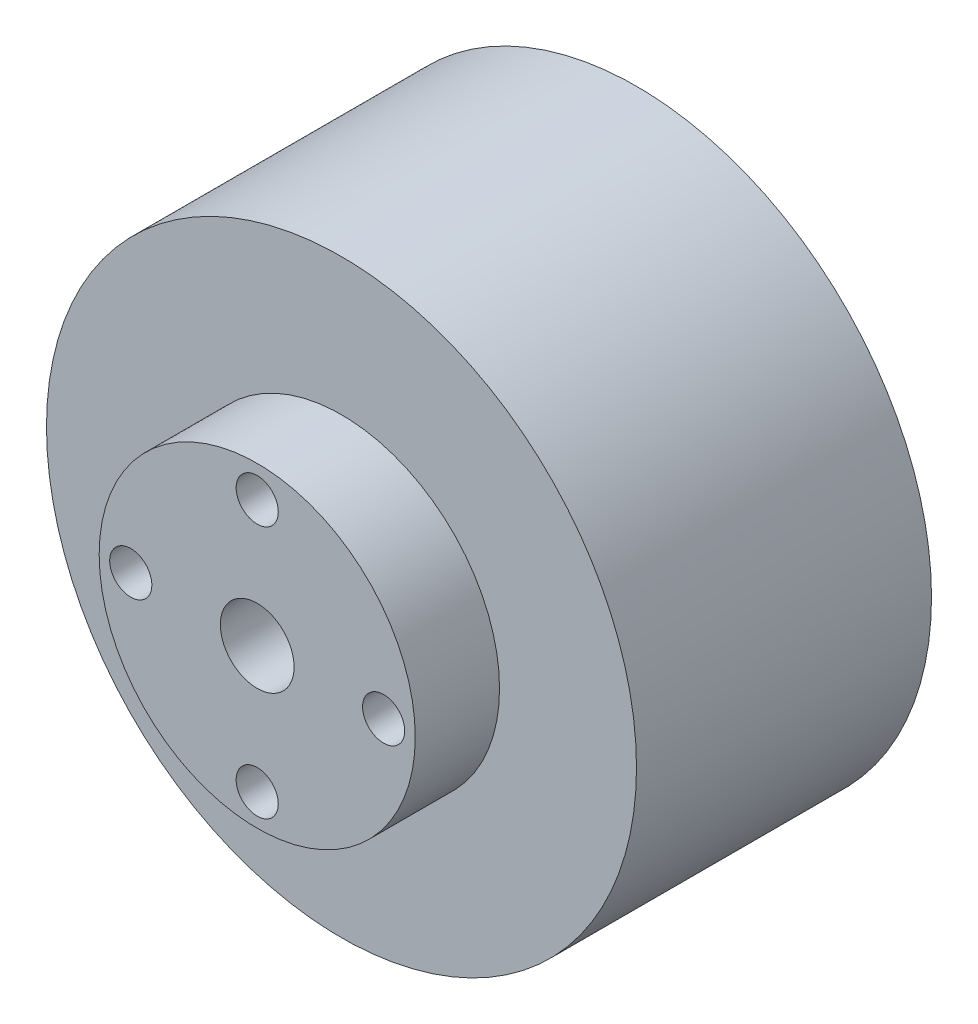
ISO-10303-21;
HEADER;
FILE_DESCRIPTION(('STEP AP214'),'2;1');
FILE_NAME('part.step','',(''),(''),'','','');
FILE_SCHEMA(('AUTOMOTIVE_DESIGN { 1 0 10303 214 1 1 1 1 }'));
ENDSEC;
DATA;
#1=APPLICATION_CONTEXT('core data for automotive mechanical design processes');
#2=APPLICATION_PROTOCOL_DEFINITION('international standard','automotive_design',2000,#1);
#3=PRODUCT_CONTEXT('',#1,'mechanical');
#4=PRODUCT('Part','Part','',(#3));
#5=PRODUCT_RELATED_PRODUCT_CATEGORY('part','',(#4));
#6=PRODUCT_DEFINITION_FORMATION('','',#4);
#7=PRODUCT_DEFINITION_CONTEXT('part definition',#1,'design');
#8=PRODUCT_DEFINITION('design','',#6,#7);
#9=PRODUCT_DEFINITION_SHAPE('','',#8);
#10=(LENGTH_UNIT() NAMED_UNIT(*) SI_UNIT(.MILLI.,.METRE.));
#11=(NAMED_UNIT(*) PLANE_ANGLE_UNIT() SI_UNIT($,.RADIAN.));
#12=(NAMED_UNIT(*) SI_UNIT($,.STERADIAN.) SOLID_ANGLE_UNIT());
#13=UNCERTAINTY_MEASURE_WITH_UNIT(LENGTH_MEASURE(1.E-05),#10,'distance_accuracy_value','');
#14=(GEOMETRIC_REPRESENTATION_CONTEXT(3) GLOBAL_UNCERTAINTY_ASSIGNED_CONTEXT((#13)) GLOBAL_UNIT_ASSIGNED_CONTEXT((#10,
#11,#12)) REPRESENTATION_CONTEXT('',''));
#15=CARTESIAN_POINT('',(0.,0.,0.));
#16=DIRECTION('',(0.,0.,1.));
#17=DIRECTION('',(1.,0.,0.));
#18=AXIS2_PLACEMENT_3D('',#15,#16,#17);
#19=CARTESIAN_POINT('',(0.,0.,14.));
#20=DIRECTION('',(0.,0.,-1.));
#21=DIRECTION('',(-1.,0.,0.));
#22=AXIS2_PLACEMENT_3D('',#19,#20,#21);
#23=CYLINDRICAL_SURFACE('',#22,14.);
#24=CARTESIAN_POINT('',(0.,0.,14.));
#25=DIRECTION('',(0.,0.,1.));
#26=DIRECTION('',(1.,0.,0.));
#27=AXIS2_PLACEMENT_3D('',#24,#25,#26);
#28=CIRCLE('',#27,14.);
#29=CARTESIAN_POINT('',(14.,0.,14.));
#30=VERTEX_POINT('',#29);
#31=EDGE_CURVE('E43',#30,#30,#28,.T.);
#32=ORIENTED_EDGE('',*,*,#31,.F.);
#33=EDGE_LOOP('',(#32));
#34=FACE_BOUND('',#33,.T.);
#35=CARTESIAN_POINT('',(0.,0.,0.));
#36=DIRECTION('',(0.,0.,1.));
#37=DIRECTION('',(1.,0.,0.));
#38=AXIS2_PLACEMENT_3D('',#35,#36,#37);
#39=CIRCLE('',#38,14.);
#40=CARTESIAN_POINT('',(14.,0.,0.));
#41=VERTEX_POINT('',#40);
#42=EDGE_CURVE('E39',#41,#41,#39,.T.);
#43=ORIENTED_EDGE('',*,*,#42,.T.);
#44=EDGE_LOOP('',(#43));
#45=FACE_BOUND('',#44,.T.);
#46=ADVANCED_FACE('F36',(#34,#45),#23,.T.);
#47=CARTESIAN_POINT('',(0.,0.,14.));
#48=DIRECTION('',(0.,0.,1.));
#49=DIRECTION('',(1.,0.,0.));
#50=AXIS2_PLACEMENT_3D('',#47,#48,#49);
#51=PLANE('',#50);
#52=CARTESIAN_POINT('',(0.,0.,14.));
#53=DIRECTION('',(0.,0.,1.));
#54=DIRECTION('',(1.,0.,0.));
#55=AXIS2_PLACEMENT_3D('',#52,#53,#54);
#56=CIRCLE('',#55,7.5);
#57=CARTESIAN_POINT('',(7.5,0.,14.));
#58=VERTEX_POINT('',#57);
#59=EDGE_CURVE('E10',#58,#58,#56,.T.);
#60=ORIENTED_EDGE('',*,*,#59,.F.);
#61=EDGE_LOOP('',(#60));
#62=FACE_BOUND('',#61,.T.);
#63=ORIENTED_EDGE('',*,*,#31,.T.);
#64=EDGE_LOOP('',(#63));
#65=FACE_BOUND('',#64,.T.);
#66=ADVANCED_FACE('F119',(#62,#65),#51,.T.);
#67=CARTESIAN_POINT('',(0.,0.,0.));
#68=DIRECTION('',(0.,0.,1.));
#69=DIRECTION('',(1.,0.,0.));
#70=AXIS2_PLACEMENT_3D('',#67,#68,#69);
#71=PLANE('',#70);
#72=CARTESIAN_POINT('',(0.,8.,0.));
#73=DIRECTION('',(0.,0.,1.));
#74=DIRECTION('',(1.,0.,0.));
#75=AXIS2_PLACEMENT_3D('',#72,#73,#74);
#76=CIRCLE('',#75,1.5);
#77=CARTESIAN_POINT('',(1.5,8.,0.));
#78=VERTEX_POINT('',#77);
#79=EDGE_CURVE('E101',#78,#78,#76,.T.);
#80=ORIENTED_EDGE('',*,*,#79,.T.);
#81=EDGE_LOOP('',(#80));
#82=FACE_BOUND('',#81,.T.);
#83=CARTESIAN_POINT('',(-8.,0.,0.));
#84=DIRECTION('',(0.,0.,1.));
#85=DIRECTION('',(1.,0.,0.));
#86=AXIS2_PLACEMENT_3D('',#83,#84,#85);
#87=CIRCLE('',#86,1.5);
#88=CARTESIAN_POINT('',(-6.5,0.,0.));
#89=VERTEX_POINT('',#88);
#90=EDGE_CURVE('E95',#89,#89,#87,.T.);
#91=ORIENTED_EDGE('',*,*,#90,.T.);
#92=EDGE_LOOP('',(#91));
#93=FACE_BOUND('',#92,.T.);
#94=CARTESIAN_POINT('',(0.,-8.,0.));
#95=DIRECTION('',(0.,0.,1.));
#96=DIRECTION('',(1.,0.,0.));
#97=AXIS2_PLACEMENT_3D('',#94,#95,#96);
#98=CIRCLE('',#97,1.5);
#99=CARTESIAN_POINT('',(1.5,-8.,0.));
#100=VERTEX_POINT('',#99);
#101=EDGE_CURVE('E89',#100,#100,#98,.T.);
#102=ORIENTED_EDGE('',*,*,#101,.T.);
#103=EDGE_LOOP('',(#102));
#104=FACE_BOUND('',#103,.T.);
#105=CARTESIAN_POINT('',(8.,0.,0.));
#106=DIRECTION('',(0.,0.,1.));
#107=DIRECTION('',(1.,0.,0.));
#108=AXIS2_PLACEMENT_3D('',#105,#106,#107);
#109=CIRCLE('',#108,1.5);
#110=CARTESIAN_POINT('',(9.5,0.,0.));
#111=VERTEX_POINT('',#110);
#112=EDGE_CURVE('E83',#111,#111,#109,.T.);
#113=ORIENTED_EDGE('',*,*,#112,.T.);
#114=EDGE_LOOP('',(#113));
#115=FACE_BOUND('',#114,.T.);
#116=CARTESIAN_POINT('',(0.,0.,0.));
#117=DIRECTION('',(0.,0.,1.));
#118=DIRECTION('',(1.,0.,0.));
#119=AXIS2_PLACEMENT_3D('',#116,#117,#118);
#120=CIRCLE('',#119,1.75);
#121=CARTESIAN_POINT('',(1.75,0.,0.));
#122=VERTEX_POINT('',#121);
#123=EDGE_CURVE('E52',#122,#122,#120,.T.);
#124=ORIENTED_EDGE('',*,*,#123,.T.);
#125=EDGE_LOOP('',(#124));
#126=FACE_BOUND('',#125,.T.);
#127=ORIENTED_EDGE('',*,*,#42,.F.);
#128=EDGE_LOOP('',(#127));
#129=FACE_BOUND('',#128,.T.);
#130=ADVANCED_FACE('F124',(#82,#93,#104,#115,#126,#129),#71,.F.);
#131=CARTESIAN_POINT('',(0.,0.,18.));
#132=DIRECTION('',(0.,0.,-1.));
#133=DIRECTION('',(-1.,0.,0.));
#134=AXIS2_PLACEMENT_3D('',#131,#132,#133);
#135=CYLINDRICAL_SURFACE('',#134,7.5);
#136=CARTESIAN_POINT('',(0.,0.,18.));
#137=DIRECTION('',(0.,0.,1.));
#138=DIRECTION('',(1.,0.,0.));
#139=AXIS2_PLACEMENT_3D('',#136,#137,#138);
#140=CIRCLE('',#139,7.5);
#141=CARTESIAN_POINT('',(7.5,0.,18.));
#142=VERTEX_POINT('',#141);
#143=EDGE_CURVE('E49',#142,#142,#140,.T.);
#144=ORIENTED_EDGE('',*,*,#143,.F.);
#145=EDGE_LOOP('',(#144));
#146=FACE_BOUND('',#145,.T.);
#147=ORIENTED_EDGE('',*,*,#59,.T.);
#148=EDGE_LOOP('',(#147));
#149=FACE_BOUND('',#148,.T.);
#150=ADVANCED_FACE('F133',(#146,#149),#135,.T.);
#151=CARTESIAN_POINT('',(0.,0.,18.));
#152=DIRECTION('',(0.,0.,1.));
#153=DIRECTION('',(1.,0.,0.));
#154=AXIS2_PLACEMENT_3D('',#151,#152,#153);
#155=PLANE('',#154);
#156=CARTESIAN_POINT('',(6.00000000000001,0.,18.));
#157=DIRECTION('',(0.,0.,1.));
#158=DIRECTION('',(1.,0.,0.));
#159=AXIS2_PLACEMENT_3D('',#156,#157,#158);
#160=CIRCLE('',#159,1.);
#161=CARTESIAN_POINT('',(7.00000000000001,0.,18.));
#162=VERTEX_POINT('',#161);
#163=EDGE_CURVE('E78',#162,#162,#160,.T.);
#164=ORIENTED_EDGE('',*,*,#163,.F.);
#165=EDGE_LOOP('',(#164));
#166=FACE_BOUND('',#165,.T.);
#167=CARTESIAN_POINT('',(-6.00000000000001,0.,18.));
#168=DIRECTION('',(0.,0.,1.));
#169=DIRECTION('',(1.,0.,0.));
#170=AXIS2_PLACEMENT_3D('',#167,#168,#169);
#171=CIRCLE('',#170,1.);
#172=CARTESIAN_POINT('',(-5.00000000000001,0.,18.));
#173=VERTEX_POINT('',#172);
#174=EDGE_CURVE('E75',#173,#173,#171,.T.);
#175=ORIENTED_EDGE('',*,*,#174,.F.);
#176=EDGE_LOOP('',(#175));
#177=FACE_BOUND('',#176,.T.);
#178=CARTESIAN_POINT('',(0.,-6.,18.));
#179=DIRECTION('',(0.,0.,1.));
#180=DIRECTION('',(1.,0.,0.));
#181=AXIS2_PLACEMENT_3D('',#178,#179,#180);
#182=CIRCLE('',#181,1.);
#183=CARTESIAN_POINT('',(1.,-6.,18.));
#184=VERTEX_POINT('',#183);
#185=EDGE_CURVE('E69',#184,#184,#182,.T.);
#186=ORIENTED_EDGE('',*,*,#185,.F.);
#187=EDGE_LOOP('',(#186));
#188=FACE_BOUND('',#187,.T.);
#189=CARTESIAN_POINT('',(0.,6.,18.));
#190=DIRECTION('',(0.,0.,1.));
#191=DIRECTION('',(1.,0.,0.));
#192=AXIS2_PLACEMENT_3D('',#189,#190,#191);
#193=CIRCLE('',#192,1.);
#194=CARTESIAN_POINT('',(1.,6.,18.));
#195=VERTEX_POINT('',#194);
#196=EDGE_CURVE('E62',#195,#195,#193,.T.);
#197=ORIENTED_EDGE('',*,*,#196,.F.);
#198=EDGE_LOOP('',(#197));
#199=FACE_BOUND('',#198,.T.);
#200=CARTESIAN_POINT('',(0.,0.,18.));
#201=DIRECTION('',(0.,0.,1.));
#202=DIRECTION('',(1.,0.,0.));
#203=AXIS2_PLACEMENT_3D('',#200,#201,#202);
#204=CIRCLE('',#203,1.75);
#205=CARTESIAN_POINT('',(1.75,0.,18.));
#206=VERTEX_POINT('',#205);
#207=EDGE_CURVE('E53',#206,#206,#204,.T.);
#208=ORIENTED_EDGE('',*,*,#207,.F.);
#209=EDGE_LOOP('',(#208));
#210=FACE_BOUND('',#209,.T.);
#211=ORIENTED_EDGE('',*,*,#143,.T.);
#212=EDGE_LOOP('',(#211));
#213=FACE_BOUND('',#212,.T.);
#214=ADVANCED_FACE('F139',(#166,#177,#188,#199,#210,#213),#155,.T.);
#215=CARTESIAN_POINT('',(0.,0.,0.));
#216=DIRECTION('',(0.,0.,1.));
#217=DIRECTION('',(1.,0.,0.));
#218=AXIS2_PLACEMENT_3D('',#215,#216,#217);
#219=CYLINDRICAL_SURFACE('',#218,1.75);
#220=ORIENTED_EDGE('',*,*,#123,.F.);
#221=EDGE_LOOP('',(#220));
#222=FACE_BOUND('',#221,.T.);
#223=ORIENTED_EDGE('',*,*,#207,.T.);
#224=EDGE_LOOP('',(#223));
#225=FACE_BOUND('',#224,.T.);
#226=ADVANCED_FACE('F146',(#222,#225),#219,.F.);
#227=CARTESIAN_POINT('',(0.,6.,15.));
#228=DIRECTION('',(0.,0.,1.));
#229=DIRECTION('',(1.,0.,0.));
#230=AXIS2_PLACEMENT_3D('',#227,#228,#229);
#231=CYLINDRICAL_SURFACE('',#230,1.);
#232=CARTESIAN_POINT('',(0.,6.,15.));
#233=DIRECTION('',(0.,0.,1.));
#234=DIRECTION('',(1.,0.,0.));
#235=AXIS2_PLACEMENT_3D('',#232,#233,#234);
#236=CIRCLE('',#235,1.);
#237=CARTESIAN_POINT('',(1.,6.,15.));
#238=VERTEX_POINT('',#237);
#239=EDGE_CURVE('E59',#238,#238,#236,.T.);
#240=ORIENTED_EDGE('',*,*,#239,.F.);
#241=EDGE_LOOP('',(#240));
#242=FACE_BOUND('',#241,.T.);
#243=ORIENTED_EDGE('',*,*,#196,.T.);
#244=EDGE_LOOP('',(#243));
#245=FACE_BOUND('',#244,.T.);
#246=ADVANCED_FACE('F150',(#242,#245),#231,.F.);
#247=CARTESIAN_POINT('',(0.,6.,15.));
#248=DIRECTION('',(0.,0.,1.));
#249=DIRECTION('',(1.,0.,0.));
#250=AXIS2_PLACEMENT_3D('',#247,#248,#249);
#251=PLANE('',#250);
#252=ORIENTED_EDGE('',*,*,#239,.T.);
#253=EDGE_LOOP('',(#252));
#254=FACE_BOUND('',#253,.T.);
#255=ADVANCED_FACE('F152',(#254),#251,.T.);
#256=CARTESIAN_POINT('',(0.,-6.,15.));
#257=DIRECTION('',(0.,0.,1.));
#258=DIRECTION('',(1.,0.,0.));
#259=AXIS2_PLACEMENT_3D('',#256,#257,#258);
#260=CYLINDRICAL_SURFACE('',#259,1.);
#261=CARTESIAN_POINT('',(0.,-6.,15.));
#262=DIRECTION('',(0.,0.,1.));
#263=DIRECTION('',(1.,0.,0.));
#264=AXIS2_PLACEMENT_3D('',#261,#262,#263);
#265=CIRCLE('',#264,1.);
#266=CARTESIAN_POINT('',(1.,-6.,15.));
#267=VERTEX_POINT('',#266);
#268=EDGE_CURVE('E66',#267,#267,#265,.T.);
#269=ORIENTED_EDGE('',*,*,#268,.F.);
#270=EDGE_LOOP('',(#269));
#271=FACE_BOUND('',#270,.T.);
#272=ORIENTED_EDGE('',*,*,#185,.T.);
#273=EDGE_LOOP('',(#272));
#274=FACE_BOUND('',#273,.T.);
#275=ADVANCED_FACE('F155',(#271,#274),#260,.F.);
#276=CARTESIAN_POINT('',(0.,-6.,15.));
#277=DIRECTION('',(0.,0.,1.));
#278=DIRECTION('',(1.,0.,0.));
#279=AXIS2_PLACEMENT_3D('',#276,#277,#278);
#280=PLANE('',#279);
#281=ORIENTED_EDGE('',*,*,#268,.T.);
#282=EDGE_LOOP('',(#281));
#283=FACE_BOUND('',#282,.T.);
#284=ADVANCED_FACE('F160',(#283),#280,.T.);
#285=CARTESIAN_POINT('',(-6.00000000000001,0.,15.));
#286=DIRECTION('',(0.,0.,1.));
#287=DIRECTION('',(1.,0.,0.));
#288=AXIS2_PLACEMENT_3D('',#285,#286,#287);
#289=CYLINDRICAL_SURFACE('',#288,1.);
#290=CARTESIAN_POINT('',(-6.00000000000001,0.,15.));
#291=DIRECTION('',(0.,0.,1.));
#292=DIRECTION('',(1.,0.,0.));
#293=AXIS2_PLACEMENT_3D('',#290,#291,#292);
#294=CIRCLE('',#293,1.);
#295=CARTESIAN_POINT('',(-5.00000000000001,0.,15.));
#296=VERTEX_POINT('',#295);
#297=EDGE_CURVE('E72',#296,#296,#294,.T.);
#298=ORIENTED_EDGE('',*,*,#297,.F.);
#299=EDGE_LOOP('',(#298));
#300=FACE_BOUND('',#299,.T.);
#301=ORIENTED_EDGE('',*,*,#174,.T.);
#302=EDGE_LOOP('',(#301));
#303=FACE_BOUND('',#302,.T.);
#304=ADVANCED_FACE('F163',(#300,#303),#289,.F.);
#305=CARTESIAN_POINT('',(-6.00000000000001,0.,15.));
#306=DIRECTION('',(0.,0.,1.));
#307=DIRECTION('',(1.,0.,0.));
#308=AXIS2_PLACEMENT_3D('',#305,#306,#307);
#309=PLANE('',#308);
#310=ORIENTED_EDGE('',*,*,#297,.T.);
#311=EDGE_LOOP('',(#310));
#312=FACE_BOUND('',#311,.T.);
#313=ADVANCED_FACE('F168',(#312),#309,.T.);
#314=CARTESIAN_POINT('',(6.00000000000001,0.,15.));
#315=DIRECTION('',(0.,0.,1.));
#316=DIRECTION('',(1.,0.,0.));
#317=AXIS2_PLACEMENT_3D('',#314,#315,#316);
#318=CYLINDRICAL_SURFACE('',#317,1.);
#319=CARTESIAN_POINT('',(6.00000000000001,0.,15.));
#320=DIRECTION('',(0.,0.,1.));
#321=DIRECTION('',(1.,0.,0.));
#322=AXIS2_PLACEMENT_3D('',#319,#320,#321);
#323=CIRCLE('',#322,1.);
#324=CARTESIAN_POINT('',(7.00000000000001,0.,15.));
#325=VERTEX_POINT('',#324);
#326=EDGE_CURVE('E56',#325,#325,#323,.T.);
#327=ORIENTED_EDGE('',*,*,#326,.F.);
#328=EDGE_LOOP('',(#327));
#329=FACE_BOUND('',#328,.T.);
#330=ORIENTED_EDGE('',*,*,#163,.T.);
#331=EDGE_LOOP('',(#330));
#332=FACE_BOUND('',#331,.T.);
#333=ADVANCED_FACE('F171',(#329,#332),#318,.F.);
#334=CARTESIAN_POINT('',(6.00000000000001,0.,15.));
#335=DIRECTION('',(0.,0.,1.));
#336=DIRECTION('',(1.,0.,0.));
#337=AXIS2_PLACEMENT_3D('',#334,#335,#336);
#338=PLANE('',#337);
#339=ORIENTED_EDGE('',*,*,#326,.T.);
#340=EDGE_LOOP('',(#339));
#341=FACE_BOUND('',#340,.T.);
#342=ADVANCED_FACE('F178',(#341),#338,.T.);
#343=CARTESIAN_POINT('',(8.,0.,3.));
#344=DIRECTION('',(0.,0.,-1.));
#345=DIRECTION('',(-1.,0.,0.));
#346=AXIS2_PLACEMENT_3D('',#343,#344,#345);
#347=CYLINDRICAL_SURFACE('',#346,1.5);
#348=CARTESIAN_POINT('',(8.,0.,3.));
#349=DIRECTION('',(0.,0.,1.));
#350=DIRECTION('',(1.,0.,0.));
#351=AXIS2_PLACEMENT_3D('',#348,#349,#350);
#352=CIRCLE('',#351,1.5);
#353=CARTESIAN_POINT('',(9.5,0.,3.));
#354=VERTEX_POINT('',#353);
#355=EDGE_CURVE('E86',#354,#354,#352,.T.);
#356=ORIENTED_EDGE('',*,*,#355,.T.);
#357=EDGE_LOOP('',(#356));
#358=FACE_BOUND('',#357,.T.);
#359=ORIENTED_EDGE('',*,*,#112,.F.);
#360=EDGE_LOOP('',(#359));
#361=FACE_BOUND('',#360,.T.);
#362=ADVANCED_FACE('F182',(#358,#361),#347,.F.);
#363=CARTESIAN_POINT('',(8.,0.,3.));
#364=DIRECTION('',(0.,0.,1.));
#365=DIRECTION('',(1.,0.,0.));
#366=AXIS2_PLACEMENT_3D('',#363,#364,#365);
#367=PLANE('',#366);
#368=ORIENTED_EDGE('',*,*,#355,.F.);
#369=EDGE_LOOP('',(#368));
#370=FACE_BOUND('',#369,.T.);
#371=ADVANCED_FACE('F186',(#370),#367,.F.);
#372=CARTESIAN_POINT('',(0.,-8.,3.));
#373=DIRECTION('',(0.,0.,-1.));
#374=DIRECTION('',(-1.,0.,0.));
#375=AXIS2_PLACEMENT_3D('',#372,#373,#374);
#376=CYLINDRICAL_SURFACE('',#375,1.5);
#377=CARTESIAN_POINT('',(0.,-8.,3.));
#378=DIRECTION('',(0.,0.,1.));
#379=DIRECTION('',(1.,0.,0.));
#380=AXIS2_PLACEMENT_3D('',#377,#378,#379);
#381=CIRCLE('',#380,1.5);
#382=CARTESIAN_POINT('',(1.5,-8.,3.));
#383=VERTEX_POINT('',#382);
#384=EDGE_CURVE('E92',#383,#383,#381,.T.);
#385=ORIENTED_EDGE('',*,*,#384,.T.);
#386=EDGE_LOOP('',(#385));
#387=FACE_BOUND('',#386,.T.);
#388=ORIENTED_EDGE('',*,*,#101,.F.);
#389=EDGE_LOOP('',(#388));
#390=FACE_BOUND('',#389,.T.);
#391=ADVANCED_FACE('F190',(#387,#390),#376,.F.);
#392=CARTESIAN_POINT('',(0.,-8.,3.));
#393=DIRECTION('',(0.,0.,1.));
#394=DIRECTION('',(1.,0.,0.));
#395=AXIS2_PLACEMENT_3D('',#392,#393,#394);
#396=PLANE('',#395);
#397=ORIENTED_EDGE('',*,*,#384,.F.);
#398=EDGE_LOOP('',(#397));
#399=FACE_BOUND('',#398,.T.);
#400=ADVANCED_FACE('F194',(#399),#396,.F.);
#401=CARTESIAN_POINT('',(-8.,0.,3.));
#402=DIRECTION('',(0.,0.,-1.));
#403=DIRECTION('',(-1.,0.,0.));
#404=AXIS2_PLACEMENT_3D('',#401,#402,#403);
#405=CYLINDRICAL_SURFACE('',#404,1.5);
#406=CARTESIAN_POINT('',(-8.,0.,3.));
#407=DIRECTION('',(0.,0.,1.));
#408=DIRECTION('',(1.,0.,0.));
#409=AXIS2_PLACEMENT_3D('',#406,#407,#408);
#410=CIRCLE('',#409,1.5);
#411=CARTESIAN_POINT('',(-6.5,0.,3.));
#412=VERTEX_POINT('',#411);
#413=EDGE_CURVE('E98',#412,#412,#410,.T.);
#414=ORIENTED_EDGE('',*,*,#413,.T.);
#415=EDGE_LOOP('',(#414));
#416=FACE_BOUND('',#415,.T.);
#417=ORIENTED_EDGE('',*,*,#90,.F.);
#418=EDGE_LOOP('',(#417));
#419=FACE_BOUND('',#418,.T.);
#420=ADVANCED_FACE('F198',(#416,#419),#405,.F.);
#421=CARTESIAN_POINT('',(-8.,0.,3.));
#422=DIRECTION('',(0.,0.,1.));
#423=DIRECTION('',(1.,0.,0.));
#424=AXIS2_PLACEMENT_3D('',#421,#422,#423);
#425=PLANE('',#424);
#426=ORIENTED_EDGE('',*,*,#413,.F.);
#427=EDGE_LOOP('',(#426));
#428=FACE_BOUND('',#427,.T.);
#429=ADVANCED_FACE('F116',(#428),#425,.F.);
#430=CARTESIAN_POINT('',(0.,8.,3.));
#431=DIRECTION('',(0.,0.,-1.));
#432=DIRECTION('',(-1.,0.,0.));
#433=AXIS2_PLACEMENT_3D('',#430,#431,#432);
#434=CYLINDRICAL_SURFACE('',#433,1.5);
#435=CARTESIAN_POINT('',(0.,8.,3.));
#436=DIRECTION('',(0.,0.,1.));
#437=DIRECTION('',(1.,0.,0.));
#438=AXIS2_PLACEMENT_3D('',#435,#436,#437);
#439=CIRCLE('',#438,1.5);
#440=CARTESIAN_POINT('',(1.5,8.,3.));
#441=VERTEX_POINT('',#440);
#442=EDGE_CURVE('E63',#441,#441,#439,.T.);
#443=ORIENTED_EDGE('',*,*,#442,.T.);
#444=EDGE_LOOP('',(#443));
#445=FACE_BOUND('',#444,.T.);
#446=ORIENTED_EDGE('',*,*,#79,.F.);
#447=EDGE_LOOP('',(#446));
#448=FACE_BOUND('',#447,.T.);
#449=ADVANCED_FACE('F107',(#445,#448),#434,.F.);
#450=CARTESIAN_POINT('',(0.,8.,3.));
#451=DIRECTION('',(0.,0.,1.));
#452=DIRECTION('',(1.,0.,0.));
#453=AXIS2_PLACEMENT_3D('',#450,#451,#452);
#454=PLANE('',#453);
#455=ORIENTED_EDGE('',*,*,#442,.F.);
#456=EDGE_LOOP('',(#455));
#457=FACE_BOUND('',#456,.T.);
#458=ADVANCED_FACE('F110',(#457),#454,.F.);
#459=CLOSED_SHELL('',(#46,#66,#130,#150,#214,#226,#246,#255,#275,#284,#304,#313,#333,#342,#362,
#371,#391,#400,#420,#429,#449,#458));
#460=MANIFOLD_SOLID_BREP('B2',#459);
#461=ADVANCED_BREP_SHAPE_REPRESENTATION('',(#18,#460),#14);
#462=SHAPE_DEFINITION_REPRESENTATION(#9,#461);
ENDSEC;
END-ISO-10303-21;
